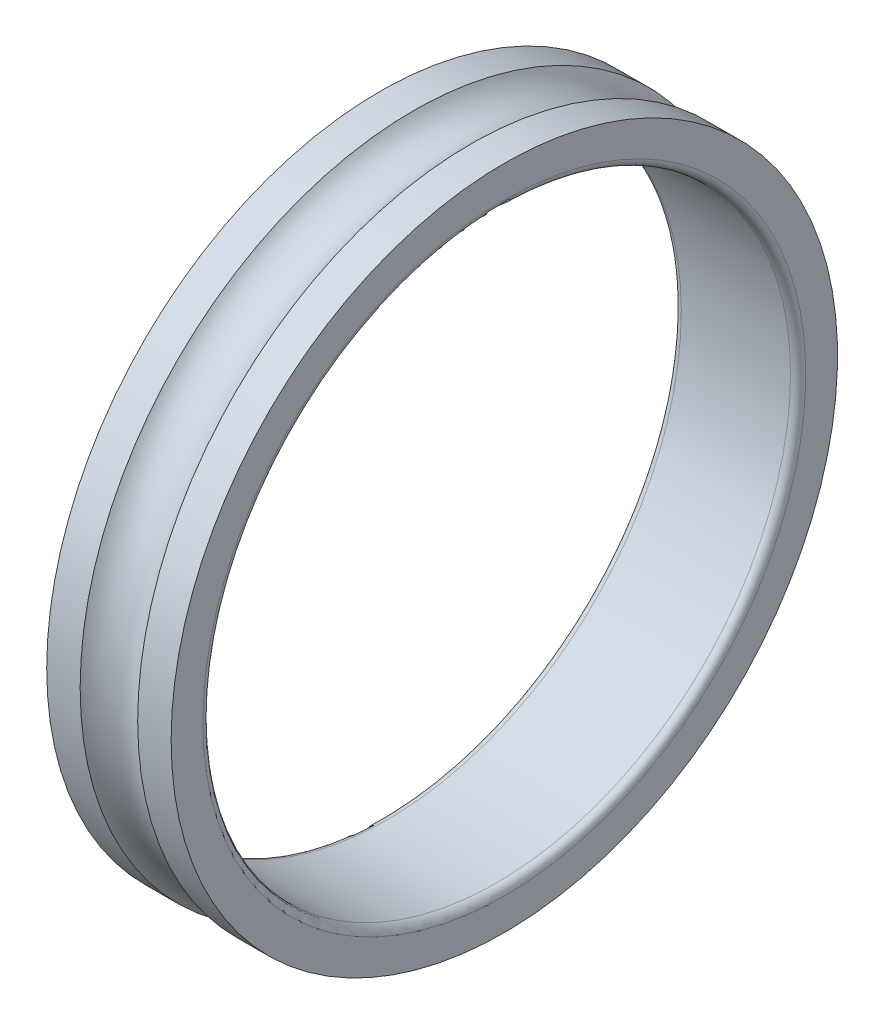
ISO-10303-21;
HEADER;
FILE_DESCRIPTION(('STEP AP214'),'2;1');
FILE_NAME('part.step','',(''),(''),'','','');
FILE_SCHEMA(('AUTOMOTIVE_DESIGN { 1 0 10303 214 1 1 1 1 }'));
ENDSEC;
DATA;
#1=APPLICATION_CONTEXT('core data for automotive mechanical design processes');
#2=APPLICATION_PROTOCOL_DEFINITION('international standard','automotive_design',2000,#1);
#3=PRODUCT_CONTEXT('',#1,'mechanical');
#4=PRODUCT('Part','Part','',(#3));
#5=PRODUCT_RELATED_PRODUCT_CATEGORY('part','',(#4));
#6=PRODUCT_DEFINITION_FORMATION('','',#4);
#7=PRODUCT_DEFINITION_CONTEXT('part definition',#1,'design');
#8=PRODUCT_DEFINITION('design','',#6,#7);
#9=PRODUCT_DEFINITION_SHAPE('','',#8);
#10=(LENGTH_UNIT() NAMED_UNIT(*) SI_UNIT(.MILLI.,.METRE.));
#11=(NAMED_UNIT(*) PLANE_ANGLE_UNIT() SI_UNIT($,.RADIAN.));
#12=(NAMED_UNIT(*) SI_UNIT($,.STERADIAN.) SOLID_ANGLE_UNIT());
#13=UNCERTAINTY_MEASURE_WITH_UNIT(LENGTH_MEASURE(1.E-05),#10,'distance_accuracy_value','');
#14=(GEOMETRIC_REPRESENTATION_CONTEXT(3) GLOBAL_UNCERTAINTY_ASSIGNED_CONTEXT((#13)) GLOBAL_UNIT_ASSIGNED_CONTEXT((#10,
#11,#12)) REPRESENTATION_CONTEXT('',''));
#15=CARTESIAN_POINT('',(0.,0.,0.));
#16=DIRECTION('',(0.,0.,1.));
#17=DIRECTION('',(1.,0.,0.));
#18=AXIS2_PLACEMENT_3D('',#15,#16,#17);
#19=CARTESIAN_POINT('',(1.10000000000035,0.,0.));
#20=DIRECTION('',(-1.,0.,0.));
#21=DIRECTION('',(0.,0.,1.));
#22=AXIS2_PLACEMENT_3D('',#19,#20,#21);
#23=TOROIDAL_SURFACE('',#22,43.6000000000004,1.10000000000035);
#24=CARTESIAN_POINT('',(1.1,0.,0.));
#25=DIRECTION('',(-1.,0.,0.));
#26=DIRECTION('',(0.,0.,1.));
#27=AXIS2_PLACEMENT_3D('',#24,#25,#26);
#28=CIRCLE('',#27,42.5);
#29=CARTESIAN_POINT('',(1.1,0.,42.5));
#30=VERTEX_POINT('',#29);
#31=EDGE_CURVE('E10',#30,#30,#28,.T.);
#32=ORIENTED_EDGE('',*,*,#31,.F.);
#33=EDGE_LOOP('',(#32));
#34=FACE_BOUND('',#33,.T.);
#35=CARTESIAN_POINT('',(0.,0.,0.));
#36=DIRECTION('',(-1.,0.,0.));
#37=DIRECTION('',(0.,0.,1.));
#38=AXIS2_PLACEMENT_3D('',#35,#36,#37);
#39=CIRCLE('',#38,43.6);
#40=CARTESIAN_POINT('',(0.,0.,43.6));
#41=VERTEX_POINT('',#40);
#42=EDGE_CURVE('E59',#41,#41,#39,.T.);
#43=ORIENTED_EDGE('',*,*,#42,.T.);
#44=EDGE_LOOP('',(#43));
#45=FACE_BOUND('',#44,.T.);
#46=ADVANCED_FACE('F31',(#34,#45),#23,.T.);
#47=CARTESIAN_POINT('',(50.,0.,0.));
#48=DIRECTION('',(-1.,0.,0.));
#49=DIRECTION('',(0.,0.,1.));
#50=AXIS2_PLACEMENT_3D('',#47,#48,#49);
#51=CYLINDRICAL_SURFACE('',#50,42.5);
#52=CARTESIAN_POINT('',(16.9,0.,0.));
#53=DIRECTION('',(-1.,0.,0.));
#54=DIRECTION('',(0.,0.,1.));
#55=AXIS2_PLACEMENT_3D('',#52,#53,#54);
#56=CIRCLE('',#55,42.5);
#57=CARTESIAN_POINT('',(16.9,0.,42.5));
#58=VERTEX_POINT('',#57);
#59=EDGE_CURVE('E37',#58,#58,#56,.T.);
#60=ORIENTED_EDGE('',*,*,#59,.F.);
#61=EDGE_LOOP('',(#60));
#62=FACE_BOUND('',#61,.T.);
#63=ORIENTED_EDGE('',*,*,#31,.T.);
#64=EDGE_LOOP('',(#63));
#65=FACE_BOUND('',#64,.T.);
#66=ADVANCED_FACE('F96',(#62,#65),#51,.F.);
#67=CARTESIAN_POINT('',(16.8999999999993,0.,0.));
#68=DIRECTION('',(-1.,0.,0.));
#69=DIRECTION('',(0.,0.,1.));
#70=AXIS2_PLACEMENT_3D('',#67,#68,#69);
#71=TOROIDAL_SURFACE('',#70,43.6000000000007,1.10000000000069);
#72=CARTESIAN_POINT('',(18.,0.,0.));
#73=DIRECTION('',(-1.,0.,0.));
#74=DIRECTION('',(0.,0.,1.));
#75=AXIS2_PLACEMENT_3D('',#72,#73,#74);
#76=CIRCLE('',#75,43.6);
#77=CARTESIAN_POINT('',(18.,0.,43.6));
#78=VERTEX_POINT('',#77);
#79=EDGE_CURVE('E41',#78,#78,#76,.T.);
#80=ORIENTED_EDGE('',*,*,#79,.F.);
#81=EDGE_LOOP('',(#80));
#82=FACE_BOUND('',#81,.T.);
#83=ORIENTED_EDGE('',*,*,#59,.T.);
#84=EDGE_LOOP('',(#83));
#85=FACE_BOUND('',#84,.T.);
#86=ADVANCED_FACE('F91',(#82,#85),#71,.T.);
#87=CARTESIAN_POINT('',(18.,43.6,0.));
#88=DIRECTION('',(-1.,0.,0.));
#89=DIRECTION('',(0.,0.,1.));
#90=AXIS2_PLACEMENT_3D('',#87,#88,#89);
#91=PLANE('',#90);
#92=CARTESIAN_POINT('',(18.,0.,0.));
#93=DIRECTION('',(-1.,0.,0.));
#94=DIRECTION('',(0.,0.,1.));
#95=AXIS2_PLACEMENT_3D('',#92,#93,#94);
#96=CIRCLE('',#95,48.2);
#97=CARTESIAN_POINT('',(18.,0.,48.2));
#98=VERTEX_POINT('',#97);
#99=EDGE_CURVE('E45',#98,#98,#96,.T.);
#100=ORIENTED_EDGE('',*,*,#99,.F.);
#101=EDGE_LOOP('',(#100));
#102=FACE_BOUND('',#101,.T.);
#103=ORIENTED_EDGE('',*,*,#79,.T.);
#104=EDGE_LOOP('',(#103));
#105=FACE_BOUND('',#104,.T.);
#106=ADVANCED_FACE('F85',(#102,#105),#91,.F.);
#107=CARTESIAN_POINT('',(50.,0.,0.));
#108=DIRECTION('',(-1.,0.,0.));
#109=DIRECTION('',(0.,0.,1.));
#110=AXIS2_PLACEMENT_3D('',#107,#108,#109);
#111=CYLINDRICAL_SURFACE('',#110,48.2);
#112=CARTESIAN_POINT('',(13.161482938809,0.,0.));
#113=DIRECTION('',(-1.,0.,0.));
#114=DIRECTION('',(0.,0.,1.));
#115=AXIS2_PLACEMENT_3D('',#112,#113,#114);
#116=CIRCLE('',#115,48.2);
#117=CARTESIAN_POINT('',(13.161482938809,0.,48.2));
#118=VERTEX_POINT('',#117);
#119=EDGE_CURVE('E50',#118,#118,#116,.T.);
#120=ORIENTED_EDGE('',*,*,#119,.F.);
#121=EDGE_LOOP('',(#120));
#122=FACE_BOUND('',#121,.T.);
#123=ORIENTED_EDGE('',*,*,#99,.T.);
#124=EDGE_LOOP('',(#123));
#125=FACE_BOUND('',#124,.T.);
#126=ADVANCED_FACE('F79',(#122,#125),#111,.T.);
#127=CARTESIAN_POINT('',(8.9999999999999,0.,0.));
#128=DIRECTION('',(-1.,0.,0.));
#129=DIRECTION('',(0.,0.,1.));
#130=AXIS2_PLACEMENT_3D('',#127,#128,#129);
#131=TOROIDAL_SURFACE('',#130,51.2499999999998,5.15949999999982);
#132=CARTESIAN_POINT('',(4.8385170611908,0.,0.));
#133=DIRECTION('',(-1.,0.,0.));
#134=DIRECTION('',(0.,0.,1.));
#135=AXIS2_PLACEMENT_3D('',#132,#133,#134);
#136=CIRCLE('',#135,48.2);
#137=CARTESIAN_POINT('',(4.8385170611908,0.,48.2));
#138=VERTEX_POINT('',#137);
#139=EDGE_CURVE('E53',#138,#138,#136,.T.);
#140=ORIENTED_EDGE('',*,*,#139,.F.);
#141=EDGE_LOOP('',(#140));
#142=FACE_BOUND('',#141,.T.);
#143=ORIENTED_EDGE('',*,*,#119,.T.);
#144=EDGE_LOOP('',(#143));
#145=FACE_BOUND('',#144,.T.);
#146=ADVANCED_FACE('F73',(#142,#145),#131,.F.);
#147=CARTESIAN_POINT('',(50.,0.,0.));
#148=DIRECTION('',(-1.,0.,0.));
#149=DIRECTION('',(0.,0.,1.));
#150=AXIS2_PLACEMENT_3D('',#147,#148,#149);
#151=CYLINDRICAL_SURFACE('',#150,48.2);
#152=CARTESIAN_POINT('',(0.,0.,0.));
#153=DIRECTION('',(-1.,0.,0.));
#154=DIRECTION('',(0.,0.,1.));
#155=AXIS2_PLACEMENT_3D('',#152,#153,#154);
#156=CIRCLE('',#155,48.2);
#157=CARTESIAN_POINT('',(0.,0.,48.2));
#158=VERTEX_POINT('',#157);
#159=EDGE_CURVE('E56',#158,#158,#156,.T.);
#160=ORIENTED_EDGE('',*,*,#159,.F.);
#161=EDGE_LOOP('',(#160));
#162=FACE_BOUND('',#161,.T.);
#163=ORIENTED_EDGE('',*,*,#139,.T.);
#164=EDGE_LOOP('',(#163));
#165=FACE_BOUND('',#164,.T.);
#166=ADVANCED_FACE('F67',(#162,#165),#151,.T.);
#167=CARTESIAN_POINT('',(0.,48.2,0.));
#168=DIRECTION('',(1.,0.,0.));
#169=DIRECTION('',(0.,0.,-1.));
#170=AXIS2_PLACEMENT_3D('',#167,#168,#169);
#171=PLANE('',#170);
#172=ORIENTED_EDGE('',*,*,#42,.F.);
#173=EDGE_LOOP('',(#172));
#174=FACE_BOUND('',#173,.T.);
#175=ORIENTED_EDGE('',*,*,#159,.T.);
#176=EDGE_LOOP('',(#175));
#177=FACE_BOUND('',#176,.T.);
#178=ADVANCED_FACE('F64',(#174,#177),#171,.F.);
#179=CLOSED_SHELL('',(#46,#66,#86,#106,#126,#146,#166,#178));
#180=MANIFOLD_SOLID_BREP('B2',#179);
#181=ADVANCED_BREP_SHAPE_REPRESENTATION('',(#18,#180),#14);
#182=SHAPE_DEFINITION_REPRESENTATION(#9,#181);
ENDSEC;
END-ISO-10303-21;
